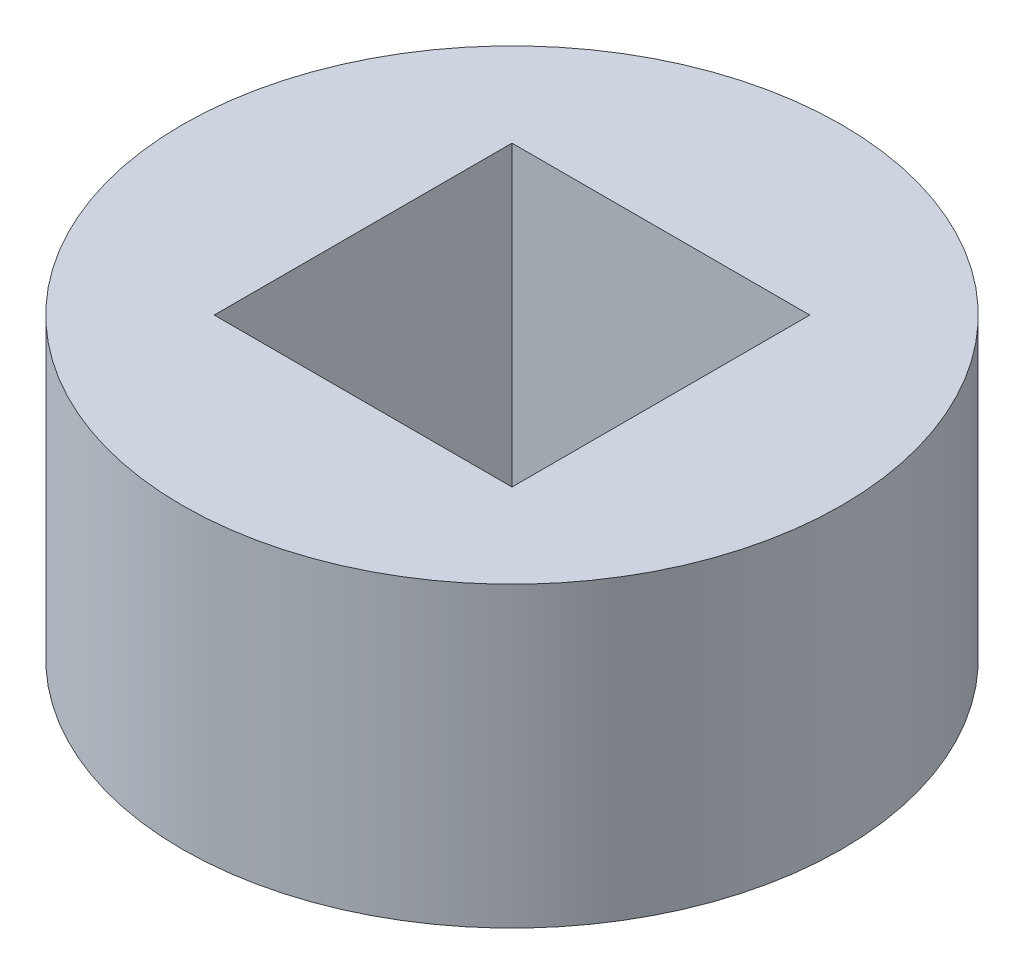
ISO-10303-21;
HEADER;
FILE_DESCRIPTION(('STEP AP214'),'2;1');
FILE_NAME('part.step','',(''),(''),'','','');
FILE_SCHEMA(('AUTOMOTIVE_DESIGN { 1 0 10303 214 1 1 1 1 }'));
ENDSEC;
DATA;
#1=APPLICATION_CONTEXT('core data for automotive mechanical design processes');
#2=APPLICATION_PROTOCOL_DEFINITION('international standard','automotive_design',2000,#1);
#3=PRODUCT_CONTEXT('',#1,'mechanical');
#4=PRODUCT('Part','Part','',(#3));
#5=PRODUCT_RELATED_PRODUCT_CATEGORY('part','',(#4));
#6=PRODUCT_DEFINITION_FORMATION('','',#4);
#7=PRODUCT_DEFINITION_CONTEXT('part definition',#1,'design');
#8=PRODUCT_DEFINITION('design','',#6,#7);
#9=PRODUCT_DEFINITION_SHAPE('','',#8);
#10=(LENGTH_UNIT() NAMED_UNIT(*) SI_UNIT(.MILLI.,.METRE.));
#11=(NAMED_UNIT(*) PLANE_ANGLE_UNIT() SI_UNIT($,.RADIAN.));
#12=(NAMED_UNIT(*) SI_UNIT($,.STERADIAN.) SOLID_ANGLE_UNIT());
#13=UNCERTAINTY_MEASURE_WITH_UNIT(LENGTH_MEASURE(1.E-05),#10,'distance_accuracy_value','');
#14=(GEOMETRIC_REPRESENTATION_CONTEXT(3) GLOBAL_UNCERTAINTY_ASSIGNED_CONTEXT((#13)) GLOBAL_UNIT_ASSIGNED_CONTEXT((#10,
#11,#12)) REPRESENTATION_CONTEXT('',''));
#15=CARTESIAN_POINT('',(0.,0.,0.));
#16=DIRECTION('',(0.,0.,1.));
#17=DIRECTION('',(1.,0.,0.));
#18=AXIS2_PLACEMENT_3D('',#15,#16,#17);
#19=CARTESIAN_POINT('',(0.,6.35,0.));
#20=DIRECTION('',(0.,1.,0.));
#21=DIRECTION('',(0.,0.,1.));
#22=AXIS2_PLACEMENT_3D('',#19,#20,#21);
#23=PLANE('',#22);
#24=CARTESIAN_POINT('',(0.,6.35,0.));
#25=DIRECTION('',(0.,1.,0.));
#26=DIRECTION('',(0.,0.,1.));
#27=AXIS2_PLACEMENT_3D('',#24,#25,#26);
#28=CIRCLE('',#27,7.03012806053458);
#29=CARTESIAN_POINT('',(0.,6.35,7.03012806053458));
#30=VERTEX_POINT('',#29);
#31=EDGE_CURVE('E11',#30,#30,#28,.T.);
#32=ORIENTED_EDGE('',*,*,#31,.T.);
#33=EDGE_LOOP('',(#32));
#34=FACE_BOUND('',#33,.T.);
#35=DIRECTION('',(-1.,0.,0.));
#36=VECTOR('',#35,1.);
#37=CARTESIAN_POINT('',(-3.175,6.35,-3.175));
#38=LINE('',#37,#36);
#39=CARTESIAN_POINT('',(3.175,6.35,-3.175));
#40=VERTEX_POINT('',#39);
#41=CARTESIAN_POINT('',(-3.175,6.35,-3.175));
#42=VERTEX_POINT('',#41);
#43=EDGE_CURVE('E82',#40,#42,#38,.T.);
#44=ORIENTED_EDGE('',*,*,#43,.F.);
#45=DIRECTION('',(0.,0.,-1.));
#46=VECTOR('',#45,1.);
#47=CARTESIAN_POINT('',(3.175,6.35,-3.175));
#48=LINE('',#47,#46);
#49=CARTESIAN_POINT('',(3.175,6.35,3.175));
#50=VERTEX_POINT('',#49);
#51=EDGE_CURVE('E74',#50,#40,#48,.T.);
#52=ORIENTED_EDGE('',*,*,#51,.F.);
#53=DIRECTION('',(1.,0.,0.));
#54=VECTOR('',#53,1.);
#55=CARTESIAN_POINT('',(-3.175,6.35,3.175));
#56=LINE('',#55,#54);
#57=CARTESIAN_POINT('',(-3.175,6.35,3.175));
#58=VERTEX_POINT('',#57);
#59=EDGE_CURVE('E95',#58,#50,#56,.T.);
#60=ORIENTED_EDGE('',*,*,#59,.F.);
#61=DIRECTION('',(0.,0.,1.));
#62=VECTOR('',#61,1.);
#63=CARTESIAN_POINT('',(-3.175,6.35,-3.175));
#64=LINE('',#63,#62);
#65=EDGE_CURVE('E93',#42,#58,#64,.T.);
#66=ORIENTED_EDGE('',*,*,#65,.F.);
#67=EDGE_LOOP('',(#44,#52,#60,#66));
#68=FACE_BOUND('',#67,.T.);
#69=ADVANCED_FACE('F33',(#34,#68),#23,.T.);
#70=CARTESIAN_POINT('',(0.,0.,0.));
#71=DIRECTION('',(0.,1.,0.));
#72=DIRECTION('',(0.,0.,1.));
#73=AXIS2_PLACEMENT_3D('',#70,#71,#72);
#74=PLANE('',#73);
#75=CARTESIAN_POINT('',(0.,0.,0.));
#76=DIRECTION('',(0.,1.,0.));
#77=DIRECTION('',(0.,0.,1.));
#78=AXIS2_PLACEMENT_3D('',#75,#76,#77);
#79=CIRCLE('',#78,7.03012806053458);
#80=CARTESIAN_POINT('',(0.,0.,7.03012806053458));
#81=VERTEX_POINT('',#80);
#82=EDGE_CURVE('E37',#81,#81,#79,.T.);
#83=ORIENTED_EDGE('',*,*,#82,.F.);
#84=EDGE_LOOP('',(#83));
#85=FACE_BOUND('',#84,.T.);
#86=DIRECTION('',(0.,0.,-1.));
#87=VECTOR('',#86,1.);
#88=CARTESIAN_POINT('',(3.175,0.,-3.175));
#89=LINE('',#88,#87);
#90=CARTESIAN_POINT('',(3.175,0.,3.175));
#91=VERTEX_POINT('',#90);
#92=CARTESIAN_POINT('',(3.175,0.,-3.175));
#93=VERTEX_POINT('',#92);
#94=EDGE_CURVE('E56',#91,#93,#89,.T.);
#95=ORIENTED_EDGE('',*,*,#94,.T.);
#96=DIRECTION('',(-1.,0.,0.));
#97=VECTOR('',#96,1.);
#98=CARTESIAN_POINT('',(-3.175,0.,-3.175));
#99=LINE('',#98,#97);
#100=CARTESIAN_POINT('',(-3.175,0.,-3.175));
#101=VERTEX_POINT('',#100);
#102=EDGE_CURVE('E89',#93,#101,#99,.T.);
#103=ORIENTED_EDGE('',*,*,#102,.T.);
#104=DIRECTION('',(0.,0.,1.));
#105=VECTOR('',#104,1.);
#106=CARTESIAN_POINT('',(-3.175,0.,-3.175));
#107=LINE('',#106,#105);
#108=CARTESIAN_POINT('',(-3.175,0.,3.175));
#109=VERTEX_POINT('',#108);
#110=EDGE_CURVE('E101',#101,#109,#107,.T.);
#111=ORIENTED_EDGE('',*,*,#110,.T.);
#112=DIRECTION('',(1.,0.,0.));
#113=VECTOR('',#112,1.);
#114=CARTESIAN_POINT('',(-3.175,0.,3.175));
#115=LINE('',#114,#113);
#116=EDGE_CURVE('E83',#109,#91,#115,.T.);
#117=ORIENTED_EDGE('',*,*,#116,.T.);
#118=EDGE_LOOP('',(#95,#103,#111,#117));
#119=FACE_BOUND('',#118,.T.);
#120=ADVANCED_FACE('F112',(#85,#119),#74,.F.);
#121=CARTESIAN_POINT('',(0.,6.35,0.));
#122=DIRECTION('',(0.,-1.,0.));
#123=DIRECTION('',(0.,0.,-1.));
#124=AXIS2_PLACEMENT_3D('',#121,#122,#123);
#125=CYLINDRICAL_SURFACE('',#124,7.03012806053458);
#126=ORIENTED_EDGE('',*,*,#31,.F.);
#127=EDGE_LOOP('',(#126));
#128=FACE_BOUND('',#127,.T.);
#129=ORIENTED_EDGE('',*,*,#82,.T.);
#130=EDGE_LOOP('',(#129));
#131=FACE_BOUND('',#130,.T.);
#132=ADVANCED_FACE('F35',(#128,#131),#125,.T.);
#133=CARTESIAN_POINT('',(3.175,6.35,-3.175));
#134=DIRECTION('',(-1.,0.,0.));
#135=DIRECTION('',(0.,0.,1.));
#136=AXIS2_PLACEMENT_3D('',#133,#134,#135);
#137=PLANE('',#136);
#138=ORIENTED_EDGE('',*,*,#94,.F.);
#139=DIRECTION('',(0.,-1.,0.));
#140=VECTOR('',#139,1.);
#141=CARTESIAN_POINT('',(3.175,6.35,3.175));
#142=LINE('',#141,#140);
#143=EDGE_CURVE('E78',#50,#91,#142,.T.);
#144=ORIENTED_EDGE('',*,*,#143,.F.);
#145=ORIENTED_EDGE('',*,*,#51,.T.);
#146=DIRECTION('',(0.,-1.,0.));
#147=VECTOR('',#146,1.);
#148=CARTESIAN_POINT('',(3.175,6.35,-3.175));
#149=LINE('',#148,#147);
#150=EDGE_CURVE('E77',#40,#93,#149,.T.);
#151=ORIENTED_EDGE('',*,*,#150,.T.);
#152=EDGE_LOOP('',(#138,#144,#145,#151));
#153=FACE_BOUND('',#152,.T.);
#154=ADVANCED_FACE('F76',(#153),#137,.T.);
#155=CARTESIAN_POINT('',(-3.175,6.35,-3.175));
#156=DIRECTION('',(0.,0.,1.));
#157=DIRECTION('',(1.,0.,0.));
#158=AXIS2_PLACEMENT_3D('',#155,#156,#157);
#159=PLANE('',#158);
#160=ORIENTED_EDGE('',*,*,#102,.F.);
#161=ORIENTED_EDGE('',*,*,#150,.F.);
#162=ORIENTED_EDGE('',*,*,#43,.T.);
#163=DIRECTION('',(0.,-1.,0.));
#164=VECTOR('',#163,1.);
#165=CARTESIAN_POINT('',(-3.175,6.35,-3.175));
#166=LINE('',#165,#164);
#167=EDGE_CURVE('E90',#42,#101,#166,.T.);
#168=ORIENTED_EDGE('',*,*,#167,.T.);
#169=EDGE_LOOP('',(#160,#161,#162,#168));
#170=FACE_BOUND('',#169,.T.);
#171=ADVANCED_FACE('F86',(#170),#159,.T.);
#172=CARTESIAN_POINT('',(-3.175,6.35,-3.175));
#173=DIRECTION('',(1.,0.,0.));
#174=DIRECTION('',(0.,0.,-1.));
#175=AXIS2_PLACEMENT_3D('',#172,#173,#174);
#176=PLANE('',#175);
#177=ORIENTED_EDGE('',*,*,#110,.F.);
#178=ORIENTED_EDGE('',*,*,#167,.F.);
#179=ORIENTED_EDGE('',*,*,#65,.T.);
#180=DIRECTION('',(0.,-1.,0.));
#181=VECTOR('',#180,1.);
#182=CARTESIAN_POINT('',(-3.175,6.35,3.175));
#183=LINE('',#182,#181);
#184=EDGE_CURVE('E48',#58,#109,#183,.T.);
#185=ORIENTED_EDGE('',*,*,#184,.T.);
#186=EDGE_LOOP('',(#177,#178,#179,#185));
#187=FACE_BOUND('',#186,.T.);
#188=ADVANCED_FACE('F110',(#187),#176,.T.);
#189=CARTESIAN_POINT('',(-3.175,6.35,3.175));
#190=DIRECTION('',(0.,0.,-1.));
#191=DIRECTION('',(-1.,0.,0.));
#192=AXIS2_PLACEMENT_3D('',#189,#190,#191);
#193=PLANE('',#192);
#194=ORIENTED_EDGE('',*,*,#116,.F.);
#195=ORIENTED_EDGE('',*,*,#184,.F.);
#196=ORIENTED_EDGE('',*,*,#59,.T.);
#197=ORIENTED_EDGE('',*,*,#143,.T.);
#198=EDGE_LOOP('',(#194,#195,#196,#197));
#199=FACE_BOUND('',#198,.T.);
#200=ADVANCED_FACE('F113',(#199),#193,.T.);
#201=CLOSED_SHELL('',(#69,#120,#132,#154,#171,#188,#200));
#202=MANIFOLD_SOLID_BREP('B2',#201);
#203=ADVANCED_BREP_SHAPE_REPRESENTATION('',(#18,#202),#14);
#204=SHAPE_DEFINITION_REPRESENTATION(#9,#203);
ENDSEC;
END-ISO-10303-21;
